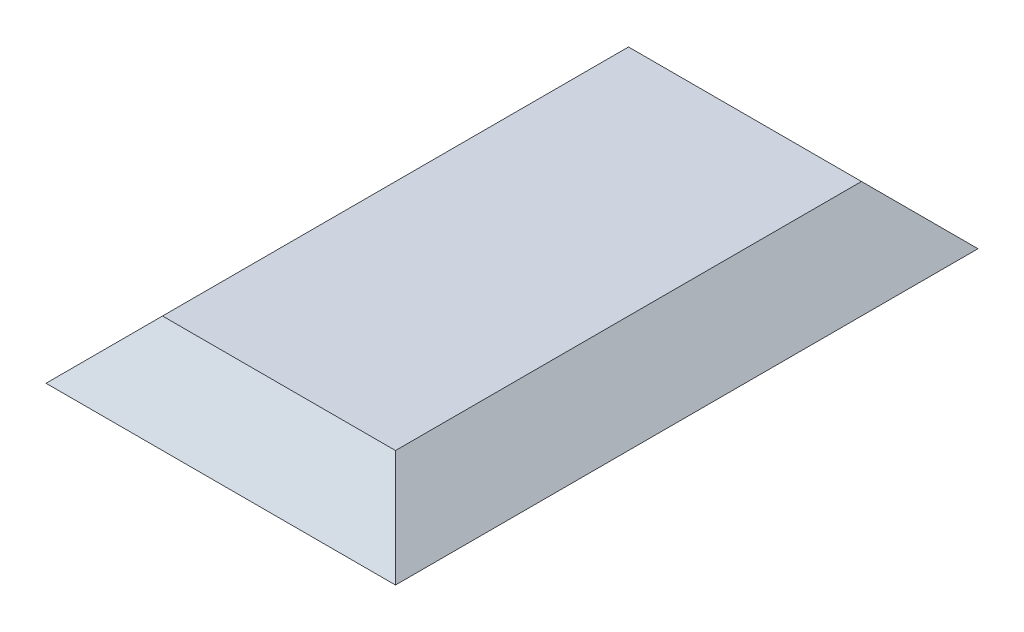
ISO-10303-21;
HEADER;
FILE_DESCRIPTION(('STEP AP214'),'2;1');
FILE_NAME('part.step','',(''),(''),'','','');
FILE_SCHEMA(('AUTOMOTIVE_DESIGN { 1 0 10303 214 1 1 1 1 }'));
ENDSEC;
DATA;
#1=APPLICATION_CONTEXT('core data for automotive mechanical design processes');
#2=APPLICATION_PROTOCOL_DEFINITION('international standard','automotive_design',2000,#1);
#3=PRODUCT_CONTEXT('',#1,'mechanical');
#4=PRODUCT('Part','Part','',(#3));
#5=PRODUCT_RELATED_PRODUCT_CATEGORY('part','',(#4));
#6=PRODUCT_DEFINITION_FORMATION('','',#4);
#7=PRODUCT_DEFINITION_CONTEXT('part definition',#1,'design');
#8=PRODUCT_DEFINITION('design','',#6,#7);
#9=PRODUCT_DEFINITION_SHAPE('','',#8);
#10=(LENGTH_UNIT() NAMED_UNIT(*) SI_UNIT(.MILLI.,.METRE.));
#11=(NAMED_UNIT(*) PLANE_ANGLE_UNIT() SI_UNIT($,.RADIAN.));
#12=(NAMED_UNIT(*) SI_UNIT($,.STERADIAN.) SOLID_ANGLE_UNIT());
#13=UNCERTAINTY_MEASURE_WITH_UNIT(LENGTH_MEASURE(1.E-05),#10,'distance_accuracy_value','');
#14=(GEOMETRIC_REPRESENTATION_CONTEXT(3) GLOBAL_UNCERTAINTY_ASSIGNED_CONTEXT((#13)) GLOBAL_UNIT_ASSIGNED_CONTEXT((#10,
#11,#12)) REPRESENTATION_CONTEXT('',''));
#15=CARTESIAN_POINT('',(0.,0.,0.));
#16=DIRECTION('',(0.,0.,1.));
#17=DIRECTION('',(1.,0.,0.));
#18=AXIS2_PLACEMENT_3D('',#15,#16,#17);
#19=CARTESIAN_POINT('',(-228.6,0.,381.));
#20=DIRECTION('',(0.,1.,0.));
#21=DIRECTION('',(-1.,0.,0.));
#22=AXIS2_PLACEMENT_3D('',#19,#20,#21);
#23=PLANE('',#22);
#24=DIRECTION('',(1.,0.,0.));
#25=VECTOR('',#24,1.);
#26=CARTESIAN_POINT('',(-228.6,0.,-381.));
#27=LINE('',#26,#25);
#28=CARTESIAN_POINT('',(-228.6,0.,-381.));
#29=VERTEX_POINT('',#28);
#30=CARTESIAN_POINT('',(228.6,0.,-381.));
#31=VERTEX_POINT('',#30);
#32=EDGE_CURVE('E156',#29,#31,#27,.T.);
#33=ORIENTED_EDGE('',*,*,#32,.T.);
#34=DIRECTION('',(0.,0.,-1.));
#35=VECTOR('',#34,1.);
#36=CARTESIAN_POINT('',(228.6,0.,381.));
#37=LINE('',#36,#35);
#38=CARTESIAN_POINT('',(228.6,0.,381.));
#39=VERTEX_POINT('',#38);
#40=EDGE_CURVE('E44',#39,#31,#37,.T.);
#41=ORIENTED_EDGE('',*,*,#40,.F.);
#42=DIRECTION('',(1.,0.,0.));
#43=VECTOR('',#42,1.);
#44=CARTESIAN_POINT('',(-228.6,0.,381.));
#45=LINE('',#44,#43);
#46=CARTESIAN_POINT('',(-228.6,0.,381.));
#47=VERTEX_POINT('',#46);
#48=EDGE_CURVE('E157',#47,#39,#45,.T.);
#49=ORIENTED_EDGE('',*,*,#48,.F.);
#50=DIRECTION('',(0.,0.,-1.));
#51=VECTOR('',#50,1.);
#52=CARTESIAN_POINT('',(-228.6,0.,381.));
#53=LINE('',#52,#51);
#54=EDGE_CURVE('E11',#47,#29,#53,.T.);
#55=ORIENTED_EDGE('',*,*,#54,.T.);
#56=EDGE_LOOP('',(#33,#41,#49,#55));
#57=FACE_BOUND('',#56,.T.);
#58=DIRECTION('',(1.,0.,0.));
#59=VECTOR('',#58,1.);
#60=CARTESIAN_POINT('',(-228.6,0.,-363.039487757862));
#61=LINE('',#60,#59);
#62=CARTESIAN_POINT('',(-210.639487757862,0.,-363.039487757862));
#63=VERTEX_POINT('',#62);
#64=CARTESIAN_POINT('',(210.639487757862,0.,-363.039487757862));
#65=VERTEX_POINT('',#64);
#66=EDGE_CURVE('E129',#63,#65,#61,.T.);
#67=ORIENTED_EDGE('',*,*,#66,.F.);
#68=DIRECTION('',(0.,0.,-1.));
#69=VECTOR('',#68,1.);
#70=CARTESIAN_POINT('',(-210.639487757862,0.,381.));
#71=LINE('',#70,#69);
#72=CARTESIAN_POINT('',(-210.639487757862,0.,363.039487757862));
#73=VERTEX_POINT('',#72);
#74=EDGE_CURVE('E108',#73,#63,#71,.T.);
#75=ORIENTED_EDGE('',*,*,#74,.F.);
#76=DIRECTION('',(1.,0.,0.));
#77=VECTOR('',#76,1.);
#78=CARTESIAN_POINT('',(-228.6,0.,363.039487757862));
#79=LINE('',#78,#77);
#80=CARTESIAN_POINT('',(210.639487757862,0.,363.039487757862));
#81=VERTEX_POINT('',#80);
#82=EDGE_CURVE('E51',#73,#81,#79,.T.);
#83=ORIENTED_EDGE('',*,*,#82,.T.);
#84=DIRECTION('',(0.,0.,-1.));
#85=VECTOR('',#84,1.);
#86=CARTESIAN_POINT('',(210.639487757862,0.,381.));
#87=LINE('',#86,#85);
#88=EDGE_CURVE('E127',#81,#65,#87,.T.);
#89=ORIENTED_EDGE('',*,*,#88,.T.);
#90=EDGE_LOOP('',(#67,#75,#83,#89));
#91=FACE_BOUND('',#90,.T.);
#92=ADVANCED_FACE('F36',(#57,#91),#23,.F.);
#93=CARTESIAN_POINT('',(-228.6,0.,381.));
#94=DIRECTION('',(0.707106781186549,-0.707106781186546,0.));
#95=DIRECTION('',(0.707106781186546,0.707106781186549,0.));
#96=AXIS2_PLACEMENT_3D('',#93,#94,#95);
#97=PLANE('',#96);
#98=ORIENTED_EDGE('',*,*,#54,.F.);
#99=DIRECTION('',(0.577350269189626,0.577350269189629,-0.577350269189622));
#100=VECTOR('',#99,1.);
#101=CARTESIAN_POINT('',(-228.6,0.,381.));
#102=LINE('',#101,#100);
#103=CARTESIAN_POINT('',(-152.4,76.2000000000003,304.800000000001));
#104=VERTEX_POINT('',#103);
#105=EDGE_CURVE('E60',#47,#104,#102,.T.);
#106=ORIENTED_EDGE('',*,*,#105,.T.);
#107=DIRECTION('',(0.,0.,-1.));
#108=VECTOR('',#107,1.);
#109=CARTESIAN_POINT('',(-152.4,76.2000000000003,381.));
#110=LINE('',#109,#108);
#111=CARTESIAN_POINT('',(-152.4,76.2000000000003,-304.800000000001));
#112=VERTEX_POINT('',#111);
#113=EDGE_CURVE('E159',#104,#112,#110,.T.);
#114=ORIENTED_EDGE('',*,*,#113,.T.);
#115=DIRECTION('',(-0.577350269189626,-0.577350269189628,-0.577350269189623));
#116=VECTOR('',#115,1.);
#117=CARTESIAN_POINT('',(25.3999999999989,254.,-127.000000000003));
#118=LINE('',#117,#116);
#119=EDGE_CURVE('E149',#112,#29,#118,.T.);
#120=ORIENTED_EDGE('',*,*,#119,.T.);
#121=EDGE_LOOP('',(#98,#106,#114,#120));
#122=FACE_BOUND('',#121,.T.);
#123=ADVANCED_FACE('F38',(#122),#97,.F.);
#124=CARTESIAN_POINT('',(152.4,76.2000000000003,381.));
#125=DIRECTION('',(-0.707106781186549,-0.707106781186546,0.));
#126=DIRECTION('',(0.707106781186546,-0.707106781186549,0.));
#127=AXIS2_PLACEMENT_3D('',#124,#125,#126);
#128=PLANE('',#127);
#129=DIRECTION('',(0.,0.,-1.));
#130=VECTOR('',#129,1.);
#131=CARTESIAN_POINT('',(152.4,76.2000000000003,381.));
#132=LINE('',#131,#130);
#133=CARTESIAN_POINT('',(152.4,76.2000000000003,304.800000000001));
#134=VERTEX_POINT('',#133);
#135=CARTESIAN_POINT('',(152.4,76.2000000000003,-304.800000000001));
#136=VERTEX_POINT('',#135);
#137=EDGE_CURVE('E164',#134,#136,#132,.T.);
#138=ORIENTED_EDGE('',*,*,#137,.F.);
#139=DIRECTION('',(0.577350269189627,-0.577350269189629,0.577350269189622));
#140=VECTOR('',#139,1.);
#141=CARTESIAN_POINT('',(177.8,50.8000000000006,330.2));
#142=LINE('',#141,#140);
#143=EDGE_CURVE('E152',#134,#39,#142,.T.);
#144=ORIENTED_EDGE('',*,*,#143,.T.);
#145=ORIENTED_EDGE('',*,*,#40,.T.);
#146=DIRECTION('',(-0.577350269189626,0.577350269189628,0.577350269189623));
#147=VECTOR('',#146,1.);
#148=CARTESIAN_POINT('',(-76.1999999999992,304.8,-76.2000000000028));
#149=LINE('',#148,#147);
#150=EDGE_CURVE('E145',#31,#136,#149,.T.);
#151=ORIENTED_EDGE('',*,*,#150,.T.);
#152=EDGE_LOOP('',(#138,#144,#145,#151));
#153=FACE_BOUND('',#152,.T.);
#154=ADVANCED_FACE('F170',(#153),#128,.F.);
#155=CARTESIAN_POINT('',(-152.4,76.2000000000003,381.));
#156=DIRECTION('',(0.,-1.,0.));
#157=DIRECTION('',(1.,0.,0.));
#158=AXIS2_PLACEMENT_3D('',#155,#156,#157);
#159=PLANE('',#158);
#160=ORIENTED_EDGE('',*,*,#113,.F.);
#161=DIRECTION('',(1.,0.,0.));
#162=VECTOR('',#161,1.);
#163=CARTESIAN_POINT('',(-228.6,76.2000000000003,304.800000000001));
#164=LINE('',#163,#162);
#165=EDGE_CURVE('E142',#104,#134,#164,.T.);
#166=ORIENTED_EDGE('',*,*,#165,.T.);
#167=ORIENTED_EDGE('',*,*,#137,.T.);
#168=DIRECTION('',(1.,0.,0.));
#169=VECTOR('',#168,1.);
#170=CARTESIAN_POINT('',(-228.6,76.2000000000003,-304.800000000001));
#171=LINE('',#170,#169);
#172=EDGE_CURVE('E138',#112,#136,#171,.T.);
#173=ORIENTED_EDGE('',*,*,#172,.F.);
#174=EDGE_LOOP('',(#160,#166,#167,#173));
#175=FACE_BOUND('',#174,.T.);
#176=ADVANCED_FACE('F180',(#175),#159,.F.);
#177=CARTESIAN_POINT('',(-228.6,76.2000000000003,-304.800000000001));
#178=DIRECTION('',(0.,-0.707106781186544,0.707106781186551));
#179=DIRECTION('',(0.,-0.707106781186551,-0.707106781186544));
#180=AXIS2_PLACEMENT_3D('',#177,#178,#179);
#181=PLANE('',#180);
#182=ORIENTED_EDGE('',*,*,#172,.T.);
#183=ORIENTED_EDGE('',*,*,#150,.F.);
#184=ORIENTED_EDGE('',*,*,#32,.F.);
#185=ORIENTED_EDGE('',*,*,#119,.F.);
#186=EDGE_LOOP('',(#182,#183,#184,#185));
#187=FACE_BOUND('',#186,.T.);
#188=ADVANCED_FACE('F175',(#187),#181,.F.);
#189=CARTESIAN_POINT('',(-228.6,76.2000000000003,304.800000000001));
#190=DIRECTION('',(0.,-0.707106781186544,-0.707106781186552));
#191=DIRECTION('',(0.,0.707106781186552,-0.707106781186544));
#192=AXIS2_PLACEMENT_3D('',#189,#190,#191);
#193=PLANE('',#192);
#194=ORIENTED_EDGE('',*,*,#48,.T.);
#195=ORIENTED_EDGE('',*,*,#143,.F.);
#196=ORIENTED_EDGE('',*,*,#165,.F.);
#197=ORIENTED_EDGE('',*,*,#105,.F.);
#198=EDGE_LOOP('',(#194,#195,#196,#197));
#199=FACE_BOUND('',#198,.T.);
#200=ADVANCED_FACE('F181',(#199),#193,.F.);
#201=CARTESIAN_POINT('',(-219.619743878931,-8.98025612106913,381.));
#202=DIRECTION('',(0.707106781186549,-0.707106781186546,0.));
#203=DIRECTION('',(0.707106781186546,0.707106781186549,0.));
#204=AXIS2_PLACEMENT_3D('',#201,#202,#203);
#205=PLANE('',#204);
#206=ORIENTED_EDGE('',*,*,#74,.T.);
#207=DIRECTION('',(-0.577350269189626,-0.577350269189628,-0.577350269189623));
#208=VECTOR('',#207,1.);
#209=CARTESIAN_POINT('',(31.386837414045,242.026325171908,-121.013162585956));
#210=LINE('',#209,#208);
#211=CARTESIAN_POINT('',(-147.139487757862,63.5000000000002,-299.539487757862));
#212=VERTEX_POINT('',#211);
#213=EDGE_CURVE('E102',#212,#63,#210,.T.);
#214=ORIENTED_EDGE('',*,*,#213,.F.);
#215=DIRECTION('',(0.,0.,-1.));
#216=VECTOR('',#215,1.);
#217=CARTESIAN_POINT('',(-147.139487757862,63.5000000000002,381.));
#218=LINE('',#217,#216);
#219=CARTESIAN_POINT('',(-147.139487757862,63.5000000000002,299.539487757862));
#220=VERTEX_POINT('',#219);
#221=EDGE_CURVE('E106',#220,#212,#218,.T.);
#222=ORIENTED_EDGE('',*,*,#221,.F.);
#223=DIRECTION('',(0.577350269189626,0.577350269189629,-0.577350269189622));
#224=VECTOR('',#223,1.);
#225=CARTESIAN_POINT('',(-222.613162585954,-11.9736748280922,375.013162585954));
#226=LINE('',#225,#224);
#227=EDGE_CURVE('E132',#73,#220,#226,.T.);
#228=ORIENTED_EDGE('',*,*,#227,.F.);
#229=EDGE_LOOP('',(#206,#214,#222,#228));
#230=FACE_BOUND('',#229,.T.);
#231=ADVANCED_FACE('F104',(#230),#205,.T.);
#232=CARTESIAN_POINT('',(143.419743878931,67.2197438789312,381.));
#233=DIRECTION('',(-0.707106781186549,-0.707106781186546,0.));
#234=DIRECTION('',(0.707106781186546,-0.707106781186549,0.));
#235=AXIS2_PLACEMENT_3D('',#232,#233,#234);
#236=PLANE('',#235);
#237=DIRECTION('',(0.,0.,-1.));
#238=VECTOR('',#237,1.);
#239=CARTESIAN_POINT('',(147.139487757862,63.5000000000003,381.));
#240=LINE('',#239,#238);
#241=CARTESIAN_POINT('',(147.139487757862,63.5000000000003,299.539487757862));
#242=VERTEX_POINT('',#241);
#243=CARTESIAN_POINT('',(147.139487757862,63.5000000000003,-299.539487757862));
#244=VERTEX_POINT('',#243);
#245=EDGE_CURVE('E125',#242,#244,#240,.T.);
#246=ORIENTED_EDGE('',*,*,#245,.T.);
#247=DIRECTION('',(-0.577350269189626,0.577350269189628,0.577350269189623));
#248=VECTOR('',#247,1.);
#249=CARTESIAN_POINT('',(-82.1868374140454,292.826325171908,-70.2131625859567));
#250=LINE('',#249,#248);
#251=EDGE_CURVE('E113',#65,#244,#250,.T.);
#252=ORIENTED_EDGE('',*,*,#251,.F.);
#253=ORIENTED_EDGE('',*,*,#88,.F.);
#254=DIRECTION('',(0.577350269189627,-0.577350269189629,0.577350269189622));
#255=VECTOR('',#254,1.);
#256=CARTESIAN_POINT('',(171.813162585954,38.8263251719084,324.213162585954));
#257=LINE('',#256,#255);
#258=EDGE_CURVE('E112',#242,#81,#257,.T.);
#259=ORIENTED_EDGE('',*,*,#258,.F.);
#260=EDGE_LOOP('',(#246,#252,#253,#259));
#261=FACE_BOUND('',#260,.T.);
#262=ADVANCED_FACE('F188',(#261),#236,.T.);
#263=CARTESIAN_POINT('',(-152.4,63.5000000000002,381.));
#264=DIRECTION('',(0.,-1.,0.));
#265=DIRECTION('',(1.,0.,0.));
#266=AXIS2_PLACEMENT_3D('',#263,#264,#265);
#267=PLANE('',#266);
#268=ORIENTED_EDGE('',*,*,#221,.T.);
#269=DIRECTION('',(1.,0.,0.));
#270=VECTOR('',#269,1.);
#271=CARTESIAN_POINT('',(-228.6,63.5000000000002,-299.539487757862));
#272=LINE('',#271,#270);
#273=EDGE_CURVE('E116',#212,#244,#272,.T.);
#274=ORIENTED_EDGE('',*,*,#273,.T.);
#275=ORIENTED_EDGE('',*,*,#245,.F.);
#276=DIRECTION('',(1.,0.,0.));
#277=VECTOR('',#276,1.);
#278=CARTESIAN_POINT('',(-152.4,63.5000000000002,299.539487757862));
#279=LINE('',#278,#277);
#280=EDGE_CURVE('E121',#220,#242,#279,.T.);
#281=ORIENTED_EDGE('',*,*,#280,.F.);
#282=EDGE_LOOP('',(#268,#274,#275,#281));
#283=FACE_BOUND('',#282,.T.);
#284=ADVANCED_FACE('F123',(#283),#267,.T.);
#285=CARTESIAN_POINT('',(-228.6,67.2197438789312,-295.819743878931));
#286=DIRECTION('',(0.,-0.707106781186544,0.707106781186551));
#287=DIRECTION('',(0.,-0.707106781186551,-0.707106781186544));
#288=AXIS2_PLACEMENT_3D('',#285,#286,#287);
#289=PLANE('',#288);
#290=ORIENTED_EDGE('',*,*,#273,.F.);
#291=ORIENTED_EDGE('',*,*,#213,.T.);
#292=ORIENTED_EDGE('',*,*,#66,.T.);
#293=ORIENTED_EDGE('',*,*,#251,.T.);
#294=EDGE_LOOP('',(#290,#291,#292,#293));
#295=FACE_BOUND('',#294,.T.);
#296=ADVANCED_FACE('F117',(#295),#289,.T.);
#297=CARTESIAN_POINT('',(-228.6,67.2197438789312,295.819743878931));
#298=DIRECTION('',(0.,-0.707106781186544,-0.707106781186552));
#299=DIRECTION('',(0.,0.707106781186552,-0.707106781186544));
#300=AXIS2_PLACEMENT_3D('',#297,#298,#299);
#301=PLANE('',#300);
#302=ORIENTED_EDGE('',*,*,#82,.F.);
#303=ORIENTED_EDGE('',*,*,#227,.T.);
#304=ORIENTED_EDGE('',*,*,#280,.T.);
#305=ORIENTED_EDGE('',*,*,#258,.T.);
#306=EDGE_LOOP('',(#302,#303,#304,#305));
#307=FACE_BOUND('',#306,.T.);
#308=ADVANCED_FACE('F248',(#307),#301,.T.);
#309=CLOSED_SHELL('',(#92,#123,#154,#176,#188,#200,#231,#262,#284,#296,#308));
#310=MANIFOLD_SOLID_BREP('B2',#309);
#311=ADVANCED_BREP_SHAPE_REPRESENTATION('',(#18,#310),#14);
#312=SHAPE_DEFINITION_REPRESENTATION(#9,#311);
ENDSEC;
END-ISO-10303-21;
